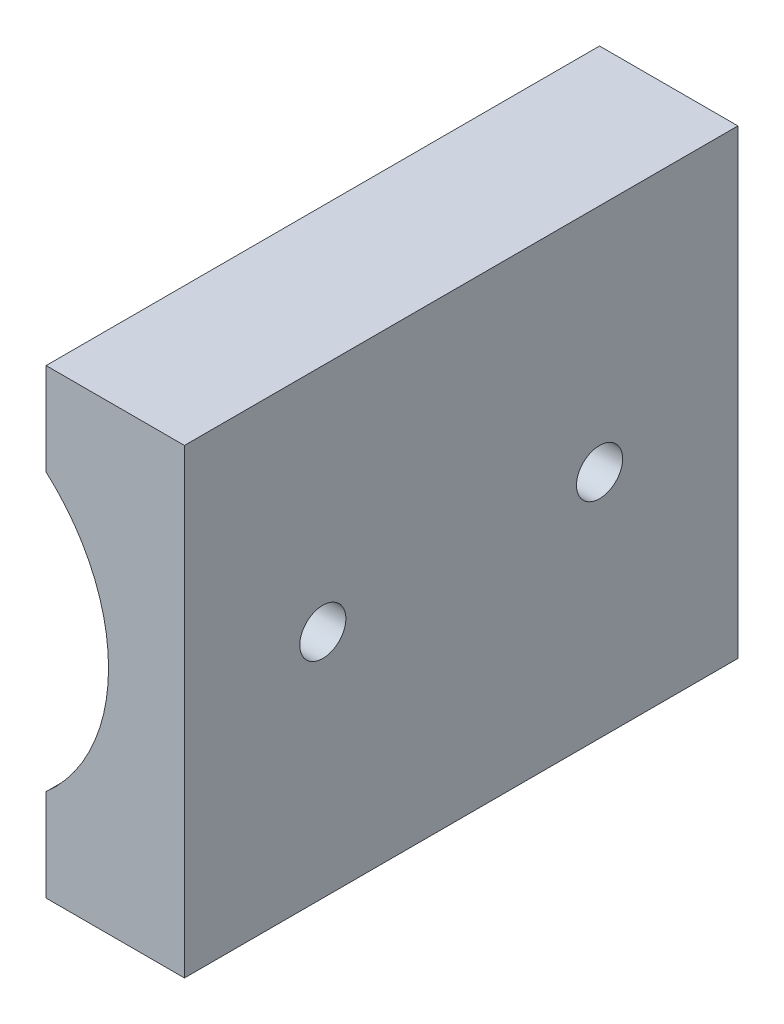
ISO-10303-21;
HEADER;
FILE_DESCRIPTION(('STEP AP214'),'2;1');
FILE_NAME('part.step','',(''),(''),'','','');
FILE_SCHEMA(('AUTOMOTIVE_DESIGN { 1 0 10303 214 1 1 1 1 }'));
ENDSEC;
DATA;
#1=APPLICATION_CONTEXT('core data for automotive mechanical design processes');
#2=APPLICATION_PROTOCOL_DEFINITION('international standard','automotive_design',2000,#1);
#3=PRODUCT_CONTEXT('',#1,'mechanical');
#4=PRODUCT('Part','Part','',(#3));
#5=PRODUCT_RELATED_PRODUCT_CATEGORY('part','',(#4));
#6=PRODUCT_DEFINITION_FORMATION('','',#4);
#7=PRODUCT_DEFINITION_CONTEXT('part definition',#1,'design');
#8=PRODUCT_DEFINITION('design','',#6,#7);
#9=PRODUCT_DEFINITION_SHAPE('','',#8);
#10=(LENGTH_UNIT() NAMED_UNIT(*) SI_UNIT(.MILLI.,.METRE.));
#11=(NAMED_UNIT(*) PLANE_ANGLE_UNIT() SI_UNIT($,.RADIAN.));
#12=(NAMED_UNIT(*) SI_UNIT($,.STERADIAN.) SOLID_ANGLE_UNIT());
#13=UNCERTAINTY_MEASURE_WITH_UNIT(LENGTH_MEASURE(1.E-05),#10,'distance_accuracy_value','');
#14=(GEOMETRIC_REPRESENTATION_CONTEXT(3) GLOBAL_UNCERTAINTY_ASSIGNED_CONTEXT((#13)) GLOBAL_UNIT_ASSIGNED_CONTEXT((#10,
#11,#12)) REPRESENTATION_CONTEXT('',''));
#15=CARTESIAN_POINT('',(0.,0.,0.));
#16=DIRECTION('',(0.,0.,1.));
#17=DIRECTION('',(1.,0.,0.));
#18=AXIS2_PLACEMENT_3D('',#15,#16,#17);
#19=CARTESIAN_POINT('',(-28.2287565553229,-2.54777070063695,60.));
#20=DIRECTION('',(0.,0.,-1.));
#21=DIRECTION('',(-1.,0.,0.));
#22=AXIS2_PLACEMENT_3D('',#19,#20,#21);
#23=CYLINDRICAL_SURFACE('',#22,20.);
#24=CARTESIAN_POINT('',(-28.2287565553229,-2.54777070063695,0.));
#25=DIRECTION('',(0.,0.,-1.));
#26=DIRECTION('',(-1.,0.,0.));
#27=AXIS2_PLACEMENT_3D('',#24,#25,#26);
#28=CIRCLE('',#27,20.);
#29=CARTESIAN_POINT('',(-15.,12.4522292993631,0.));
#30=VERTEX_POINT('',#29);
#31=CARTESIAN_POINT('',(-15.,-17.5477707006369,0.));
#32=VERTEX_POINT('',#31);
#33=EDGE_CURVE('E126',#30,#32,#28,.T.);
#34=ORIENTED_EDGE('',*,*,#33,.T.);
#35=DIRECTION('',(0.,0.,-1.));
#36=VECTOR('',#35,1.);
#37=CARTESIAN_POINT('',(-15.,-17.5477707006369,60.));
#38=LINE('',#37,#36);
#39=CARTESIAN_POINT('',(-15.,-17.5477707006369,60.));
#40=VERTEX_POINT('',#39);
#41=EDGE_CURVE('E111',#40,#32,#38,.T.);
#42=ORIENTED_EDGE('',*,*,#41,.F.);
#43=CARTESIAN_POINT('',(-28.2287565553229,-2.54777070063695,60.));
#44=DIRECTION('',(0.,0.,-1.));
#45=DIRECTION('',(-1.,0.,0.));
#46=AXIS2_PLACEMENT_3D('',#43,#44,#45);
#47=CIRCLE('',#46,20.);
#48=CARTESIAN_POINT('',(-15.,12.4522292993631,60.));
#49=VERTEX_POINT('',#48);
#50=EDGE_CURVE('E102',#49,#40,#47,.T.);
#51=ORIENTED_EDGE('',*,*,#50,.F.);
#52=DIRECTION('',(0.,0.,-1.));
#53=VECTOR('',#52,1.);
#54=CARTESIAN_POINT('',(-15.,12.4522292993631,60.));
#55=LINE('',#54,#53);
#56=EDGE_CURVE('E43',#49,#30,#55,.T.);
#57=ORIENTED_EDGE('',*,*,#56,.T.);
#58=EDGE_LOOP('',(#34,#42,#51,#57));
#59=FACE_BOUND('',#58,.T.);
#60=CARTESIAN_POINT('',(-8.22875655532294,-2.54777070063694,12.5));
#61=CARTESIAN_POINT('',(-8.22875850635866,-2.6876117961927,12.5000059409357));
#62=CARTESIAN_POINT('',(-8.23023870977393,-2.82754027493969,12.5117728791693));
#63=CARTESIAN_POINT('',(-8.23600115420934,-3.10350350272669,12.5585277545708));
#64=CARTESIAN_POINT('',(-8.24028632090865,-3.23953403126069,12.5935399379234));
#65=CARTESIAN_POINT('',(-8.25117594487888,-3.50366627545,12.6857376439141));
#66=CARTESIAN_POINT('',(-8.25777884076752,-3.63177326078308,12.7429082418099));
#67=CARTESIAN_POINT('',(-8.27256954654197,-3.87655017552998,12.8777672839698));
#68=CARTESIAN_POINT('',(-8.28075708448179,-3.99322206219331,12.9554522085307));
#69=CARTESIAN_POINT('',(-8.29785334225969,-4.21248351756826,13.1295919498396));
#70=CARTESIAN_POINT('',(-8.30676540839877,-4.31500106557407,13.2261371293462));
#71=CARTESIAN_POINT('',(-8.32427929522544,-4.50242349419443,13.4350628235366));
#72=CARTESIAN_POINT('',(-8.33288110008026,-4.58732747702919,13.5474441449132));
#73=CARTESIAN_POINT('',(-8.34883349912709,-4.73738086192088,13.7853199775657));
#74=CARTESIAN_POINT('',(-8.35617978354383,-4.80246279657801,13.9108573615679));
#75=CARTESIAN_POINT('',(-8.36874527074612,-4.91059377721206,14.1711870519474));
#76=CARTESIAN_POINT('',(-8.37396455419159,-4.95364365870216,14.305979007147));
#77=CARTESIAN_POINT('',(-8.38165315928681,-5.0162696806617,14.5802441955868));
#78=CARTESIAN_POINT('',(-8.38413672095549,-5.03596741536864,14.7196892577042));
#79=CARTESIAN_POINT('',(-8.38611627389503,-5.05170625019417,14.9999262634718));
#80=CARTESIAN_POINT('',(-8.38561238530787,-5.04774830163936,15.1407181527313));
#81=CARTESIAN_POINT('',(-8.38168700162542,-5.01638793708484,15.4188048272488));
#82=CARTESIAN_POINT('',(-8.37828217571965,-4.98911946362164,15.5561149862003));
#83=CARTESIAN_POINT('',(-8.36896455774665,-4.91212108381899,15.824195021219));
#84=CARTESIAN_POINT('',(-8.36305171486571,-4.86239072238885,15.954964764714));
#85=CARTESIAN_POINT('',(-8.34936539667643,-4.74173626054859,16.2066679990217));
#86=CARTESIAN_POINT('',(-8.34158682320851,-4.67075395434458,16.327573300249));
#87=CARTESIAN_POINT('',(-8.32504944101697,-4.50965217009386,16.5558066944132));
#88=CARTESIAN_POINT('',(-8.31629058746632,-4.41953181671772,16.6631341659737));
#89=CARTESIAN_POINT('',(-8.2987054564187,-4.22196981139072,16.8619427107227));
#90=CARTESIAN_POINT('',(-8.28987913145404,-4.11441270847695,16.953309091766));
#91=CARTESIAN_POINT('',(-8.27321022976442,-3.88542786975086,17.1167088800305));
#92=CARTESIAN_POINT('',(-8.26536765530789,-3.76400010195519,17.188742242672));
#93=CARTESIAN_POINT('',(-8.25154503313715,-3.51063237200042,17.3114313204639));
#94=CARTESIAN_POINT('',(-8.24556561130758,-3.37868889597466,17.3620798538812));
#95=CARTESIAN_POINT('',(-8.23614869752233,-3.108078641068,17.4404704935233));
#96=CARTESIAN_POINT('',(-8.23271108656425,-2.96941217726761,17.468213672137));
#97=CARTESIAN_POINT('',(-8.22878059121535,-2.69028386455044,17.4998574242606));
#98=CARTESIAN_POINT('',(-8.22826819389659,-2.54984019083555,17.5039159923641));
#99=CARTESIAN_POINT('',(-8.23019317526865,-2.27027466413945,17.488492265944));
#100=CARTESIAN_POINT('',(-8.23263049114082,-2.13115278307224,17.4690104727484));
#101=CARTESIAN_POINT('',(-8.24016886775603,-1.85864619291542,17.4071902912256));
#102=CARTESIAN_POINT('',(-8.24526114718426,-1.72524413021224,17.3649272365974));
#103=CARTESIAN_POINT('',(-8.25753932432098,-1.46742104577854,17.2588225480871));
#104=CARTESIAN_POINT('',(-8.26472529311671,-1.34300032917163,17.1949801815086));
#105=CARTESIAN_POINT('',(-8.28043832622182,-1.10596617994952,17.0471468624925));
#106=CARTESIAN_POINT('',(-8.28897211489786,-0.993416940693123,16.9630537101944));
#107=CARTESIAN_POINT('',(-8.30640513206639,-0.783973711010624,16.7772505024658));
#108=CARTESIAN_POINT('',(-8.31530437505397,-0.687080342300085,16.675539747749));
#109=CARTESIAN_POINT('',(-8.3325255006971,-0.511138741818927,16.4566925832429));
#110=CARTESIAN_POINT('',(-8.34084380810968,-0.432195240069011,16.3394716536896));
#111=CARTESIAN_POINT('',(-8.35590244495146,-0.295117811193438,16.0933417551453));
#112=CARTESIAN_POINT('',(-8.36264280601267,-0.236983466908575,15.9644330205235));
#113=CARTESIAN_POINT('',(-8.37375805139299,-0.143344121770403,15.6989246808524));
#114=CARTESIAN_POINT('',(-8.37813910347506,-0.107780073179836,15.562346169952));
#115=CARTESIAN_POINT('',(-8.3840573962484,-0.0601007067690974,15.2850975162193));
#116=CARTESIAN_POINT('',(-8.38559476923518,-0.0479842981011809,15.144427564041));
#117=CARTESIAN_POINT('',(-8.3856477854984,-0.0475641645521071,14.8640310707953));
#118=CARTESIAN_POINT('',(-8.38418430780341,-0.0590959029376697,14.7243047516681));
#119=CARTESIAN_POINT('',(-8.37844540995093,-0.105296295787617,14.4487928706549));
#120=CARTESIAN_POINT('',(-8.37416998949214,-0.139964952731174,14.3130073091912));
#121=CARTESIAN_POINT('',(-8.36329539757745,-0.231403626947287,14.0492530432336));
#122=CARTESIAN_POINT('',(-8.35669705939511,-0.288165719666009,13.9212815549782));
#123=CARTESIAN_POINT('',(-8.34191872287475,-0.422163798486632,13.6766533459517));
#124=CARTESIAN_POINT('',(-8.33373870471882,-0.499400041127352,13.5599967669802));
#125=CARTESIAN_POINT('',(-8.31665050780061,-0.672764369371103,13.3404687746595));
#126=CARTESIAN_POINT('',(-8.30773783448261,-0.769015074861984,13.237694539045));
#127=CARTESIAN_POINT('',(-8.29022823939394,-0.977420473668559,13.049693174832));
#128=CARTESIAN_POINT('',(-8.28163139256704,-1.08957891149537,12.9644701892257));
#129=CARTESIAN_POINT('',(-8.26568598945548,-1.32710507978273,12.8137146428947));
#130=CARTESIAN_POINT('',(-8.25834230453994,-1.45252142104077,12.7482581941007));
#131=CARTESIAN_POINT('',(-8.2457800645557,-1.71258779833566,12.6394287570837));
#132=CARTESIAN_POINT('',(-8.2405592016272,-1.84722761976671,12.5960317736465));
#133=CARTESIAN_POINT('',(-8.23408935204549,-2.07676492866902,12.5429406618287));
#134=CARTESIAN_POINT('',(-8.23209929636841,-2.17021503712002,12.5268610580179));
#135=CARTESIAN_POINT('',(-8.22943224203106,-2.35835363742451,12.5053887543068));
#136=CARTESIAN_POINT('',(-8.22875523368825,-2.45304212014091,12.4999959756007));
#137=CARTESIAN_POINT('',(-8.22875655532294,-2.54777070063694,12.5));
#138=B_SPLINE_CURVE_WITH_KNOTS('',3,(#60,#61,#62,#63,#64,#65,#66,#67,#68,#69,#70,#71,#72,#73,
#74,#75,#76,#77,#78,#79,#80,#81,#82,#83,#84,#85,#86,#87,#88,#89,#90,#91,#92,#93,#94,#95,#96,#97,
#98,#99,#100,#101,#102,#103,#104,#105,#106,#107,#108,#109,#110,#111,#112,#113,#114,#115,#116,
#117,#118,#119,#120,#121,#122,#123,#124,#125,#126,#127,#128,#129,#130,#131,#132,#133,#134,#135,
#136,#137),.UNSPECIFIED.,.T.,.F.,(4,2,2,2,2,2,2,2,2,2,2,2,2,2,2,2,2,2,2,2,2,2,2,2,2,2,2,2,2,2,2,
2,2,2,2,2,2,2,4),(0.,0.419177272776246,0.838792460943426,1.25812550818177,1.67738665591073,
2.09870813201843,2.5200510780001,2.94281250318869,3.36555789496807,3.78609225286321,
4.20660969884664,4.62472696441691,5.04285270166241,5.46213426285532,5.88143500513638,
6.30363478136416,6.72583553113113,7.14817795731605,7.5705006090378,7.99000279391921,
8.40949604501928,8.82761053893395,9.24573923078947,9.66602402928422,10.0863255137509,
10.5090197150757,10.9317054422154,11.3532807428092,11.7748364301062,12.1934690120221,
12.6121016387955,13.0305842470649,13.4490720991226,13.8703523769183,14.2917319847001,
14.7147140303685,15.1372349868403,15.4211884318763,15.7051397830044),.UNSPECIFIED.);
#139=CARTESIAN_POINT('',(-8.22875655532294,-2.54777070063694,12.5));
#140=VERTEX_POINT('',#139);
#141=EDGE_CURVE('E137',#140,#140,#138,.T.);
#142=ORIENTED_EDGE('',*,*,#141,.F.);
#143=EDGE_LOOP('',(#142));
#144=FACE_BOUND('',#143,.T.);
#145=CARTESIAN_POINT('',(-8.22875655532294,-2.54777070063694,42.5));
#146=CARTESIAN_POINT('',(-8.22875850635866,-2.6876117961927,42.5000059409357));
#147=CARTESIAN_POINT('',(-8.23023870977393,-2.82754027493969,42.5117728791693));
#148=CARTESIAN_POINT('',(-8.23600115420934,-3.10350350272669,42.5585277545708));
#149=CARTESIAN_POINT('',(-8.24028632090865,-3.23953403126069,42.5935399379234));
#150=CARTESIAN_POINT('',(-8.25117594487888,-3.50366627545,42.6857376439141));
#151=CARTESIAN_POINT('',(-8.25777884076753,-3.63177326078308,42.7429082418099));
#152=CARTESIAN_POINT('',(-8.27256954654197,-3.87655017552998,42.8777672839698));
#153=CARTESIAN_POINT('',(-8.28075708448179,-3.99322206219331,42.9554522085307));
#154=CARTESIAN_POINT('',(-8.29785334225969,-4.21248351756826,43.1295919498396));
#155=CARTESIAN_POINT('',(-8.30676540839878,-4.31500106557407,43.2261371293462));
#156=CARTESIAN_POINT('',(-8.32427929522544,-4.50242349419443,43.4350628235366));
#157=CARTESIAN_POINT('',(-8.33288110008026,-4.58732747702919,43.5474441449132));
#158=CARTESIAN_POINT('',(-8.3488334991271,-4.73738086192088,43.7853199775657));
#159=CARTESIAN_POINT('',(-8.35617978354384,-4.80246279657802,43.9108573615679));
#160=CARTESIAN_POINT('',(-8.36874527074612,-4.91059377721206,44.1711870519474));
#161=CARTESIAN_POINT('',(-8.37396455419159,-4.95364365870216,44.305979007147));
#162=CARTESIAN_POINT('',(-8.38165315928681,-5.01626968066171,44.5802441955868));
#163=CARTESIAN_POINT('',(-8.3841367209555,-5.03596741536865,44.7196892577042));
#164=CARTESIAN_POINT('',(-8.38611627389503,-5.05170625019417,44.9999262634718));
#165=CARTESIAN_POINT('',(-8.38561238530787,-5.04774830163936,45.1407181527313));
#166=CARTESIAN_POINT('',(-8.38168700162543,-5.01638793708485,45.4188048272488));
#167=CARTESIAN_POINT('',(-8.37828217571966,-4.98911946362164,45.5561149862003));
#168=CARTESIAN_POINT('',(-8.36896455774666,-4.91212108381899,45.824195021219));
#169=CARTESIAN_POINT('',(-8.36305171486571,-4.86239072238885,45.954964764714));
#170=CARTESIAN_POINT('',(-8.34936539667643,-4.74173626054859,46.2066679990217));
#171=CARTESIAN_POINT('',(-8.34158682320851,-4.67075395434458,46.327573300249));
#172=CARTESIAN_POINT('',(-8.32504944101697,-4.50965217009386,46.5558066944132));
#173=CARTESIAN_POINT('',(-8.31629058746632,-4.41953181671772,46.6631341659737));
#174=CARTESIAN_POINT('',(-8.2987054564187,-4.22196981139072,46.8619427107227));
#175=CARTESIAN_POINT('',(-8.28987913145404,-4.11441270847696,46.953309091766));
#176=CARTESIAN_POINT('',(-8.27321022976442,-3.88542786975087,47.1167088800306));
#177=CARTESIAN_POINT('',(-8.26536765530789,-3.7640001019552,47.188742242672));
#178=CARTESIAN_POINT('',(-8.25154503313715,-3.51063237200043,47.3114313204639));
#179=CARTESIAN_POINT('',(-8.24556561130758,-3.37868889597466,47.3620798538812));
#180=CARTESIAN_POINT('',(-8.23614869752233,-3.108078641068,47.4404704935233));
#181=CARTESIAN_POINT('',(-8.23271108656425,-2.96941217726761,47.468213672137));
#182=CARTESIAN_POINT('',(-8.22878059121534,-2.69028386455044,47.4998574242605));
#183=CARTESIAN_POINT('',(-8.22826819389659,-2.54984019083555,47.5039159923641));
#184=CARTESIAN_POINT('',(-8.23019317526865,-2.27027466413944,47.4884922659441));
#185=CARTESIAN_POINT('',(-8.23263049114082,-2.13115278307223,47.4690104727484));
#186=CARTESIAN_POINT('',(-8.24016886775602,-1.85864619291542,47.4071902912256));
#187=CARTESIAN_POINT('',(-8.24526114718426,-1.72524413021223,47.3649272365974));
#188=CARTESIAN_POINT('',(-8.25753932432098,-1.46742104577853,47.2588225480871));
#189=CARTESIAN_POINT('',(-8.26472529311671,-1.34300032917163,47.1949801815086));
#190=CARTESIAN_POINT('',(-8.28043832622183,-1.10596617994951,47.0471468624925));
#191=CARTESIAN_POINT('',(-8.28897211489786,-0.99341694069312,46.9630537101944));
#192=CARTESIAN_POINT('',(-8.30640513206638,-0.783973711010621,46.7772505024658));
#193=CARTESIAN_POINT('',(-8.31530437505396,-0.687080342300082,46.675539747749));
#194=CARTESIAN_POINT('',(-8.3325255006971,-0.511138741818924,46.4566925832429));
#195=CARTESIAN_POINT('',(-8.34084380810968,-0.432195240069007,46.3394716536896));
#196=CARTESIAN_POINT('',(-8.35590244495146,-0.295117811193434,46.0933417551453));
#197=CARTESIAN_POINT('',(-8.36264280601268,-0.236983466908572,45.9644330205235));
#198=CARTESIAN_POINT('',(-8.373758051393,-0.1433441217704,45.6989246808524));
#199=CARTESIAN_POINT('',(-8.37813910347506,-0.107780073179832,45.562346169952));
#200=CARTESIAN_POINT('',(-8.3840573962484,-0.060100706769094,45.2850975162193));
#201=CARTESIAN_POINT('',(-8.38559476923518,-0.0479842981011774,45.144427564041));
#202=CARTESIAN_POINT('',(-8.3856477854984,-0.0475641645521031,44.8640310707953));
#203=CARTESIAN_POINT('',(-8.38418430780341,-0.0590959029376659,44.7243047516681));
#204=CARTESIAN_POINT('',(-8.37844540995094,-0.105296295787613,44.4487928706549));
#205=CARTESIAN_POINT('',(-8.37416998949213,-0.13996495273117,44.3130073091912));
#206=CARTESIAN_POINT('',(-8.36329539757745,-0.231403626947284,44.0492530432336));
#207=CARTESIAN_POINT('',(-8.35669705939511,-0.288165719666008,43.9212815549782));
#208=CARTESIAN_POINT('',(-8.34191872287476,-0.422163798486632,43.6766533459517));
#209=CARTESIAN_POINT('',(-8.33373870471882,-0.499400041127351,43.5599967669802));
#210=CARTESIAN_POINT('',(-8.31665050780061,-0.6727643693711,43.3404687746595));
#211=CARTESIAN_POINT('',(-8.30773783448262,-0.769015074861981,43.237694539045));
#212=CARTESIAN_POINT('',(-8.29022823939395,-0.977420473668557,43.049693174832));
#213=CARTESIAN_POINT('',(-8.28163139256705,-1.08957891149537,42.9644701892257));
#214=CARTESIAN_POINT('',(-8.26568598945548,-1.32710507978273,42.8137146428947));
#215=CARTESIAN_POINT('',(-8.25834230453994,-1.45252142104077,42.7482581941007));
#216=CARTESIAN_POINT('',(-8.2457800645557,-1.71258779833566,42.6394287570837));
#217=CARTESIAN_POINT('',(-8.2405592016272,-1.8472276197667,42.5960317736465));
#218=CARTESIAN_POINT('',(-8.23408935204549,-2.07676492866901,42.5429406618287));
#219=CARTESIAN_POINT('',(-8.23209929636841,-2.17021503712002,42.5268610580179));
#220=CARTESIAN_POINT('',(-8.22943224203106,-2.35835363742451,42.5053887543068));
#221=CARTESIAN_POINT('',(-8.22875523368825,-2.45304212014091,42.4999959756007));
#222=CARTESIAN_POINT('',(-8.22875655532294,-2.54777070063694,42.5));
#223=B_SPLINE_CURVE_WITH_KNOTS('',3,(#145,#146,#147,#148,#149,#150,#151,#152,#153,#154,#155,
#156,#157,#158,#159,#160,#161,#162,#163,#164,#165,#166,#167,#168,#169,#170,#171,#172,#173,#174,
#175,#176,#177,#178,#179,#180,#181,#182,#183,#184,#185,#186,#187,#188,#189,#190,#191,#192,#193,
#194,#195,#196,#197,#198,#199,#200,#201,#202,#203,#204,#205,#206,#207,#208,#209,#210,#211,#212,
#213,#214,#215,#216,#217,#218,#219,#220,#221,#222),.UNSPECIFIED.,.T.,.F.,(4,2,2,2,2,2,2,2,2,2,2,
2,2,2,2,2,2,2,2,2,2,2,2,2,2,2,2,2,2,2,2,2,2,2,2,2,2,2,4),(0.,0.419177272776248,
0.838792460943427,1.25812550818177,1.67738665591073,2.09870813201843,2.52005107800011,
2.9428125031887,3.36555789496807,3.78609225286321,4.20660969884664,4.62472696441693,
5.04285270166242,5.46213426285534,5.88143500513638,6.30363478136417,6.72583553113114,
7.14817795731605,7.57050060903781,7.99000279391922,8.40949604501929,8.82761053893396,
9.24573923078948,9.66602402928423,10.0863255137509,10.5090197150757,10.9317054422154,
11.3532807428093,11.7748364301062,12.1934690120222,12.6121016387955,13.0305842470649,
13.4490720991226,13.8703523769183,14.2917319847001,14.7147140303685,15.1372349868403,
15.4211884318763,15.7051397830044),.UNSPECIFIED.);
#224=CARTESIAN_POINT('',(-8.22875655532294,-2.54777070063694,42.5));
#225=VERTEX_POINT('',#224);
#226=EDGE_CURVE('E145',#225,#225,#223,.T.);
#227=ORIENTED_EDGE('',*,*,#226,.F.);
#228=EDGE_LOOP('',(#227));
#229=FACE_BOUND('',#228,.T.);
#230=ADVANCED_FACE('F33',(#59,#144,#229),#23,.F.);
#231=CARTESIAN_POINT('',(0.,22.4522292993631,60.));
#232=DIRECTION('',(0.,-1.,0.));
#233=DIRECTION('',(1.,0.,0.));
#234=AXIS2_PLACEMENT_3D('',#231,#232,#233);
#235=PLANE('',#234);
#236=DIRECTION('',(-1.,0.,0.));
#237=VECTOR('',#236,1.);
#238=CARTESIAN_POINT('',(0.,22.4522292993631,0.));
#239=LINE('',#238,#237);
#240=CARTESIAN_POINT('',(0.,22.4522292993631,0.));
#241=VERTEX_POINT('',#240);
#242=CARTESIAN_POINT('',(-15.,22.4522292993631,0.));
#243=VERTEX_POINT('',#242);
#244=EDGE_CURVE('E120',#241,#243,#239,.T.);
#245=ORIENTED_EDGE('',*,*,#244,.T.);
#246=DIRECTION('',(0.,0.,-1.));
#247=VECTOR('',#246,1.);
#248=CARTESIAN_POINT('',(-15.,22.4522292993631,60.));
#249=LINE('',#248,#247);
#250=CARTESIAN_POINT('',(-15.,22.4522292993631,60.));
#251=VERTEX_POINT('',#250);
#252=EDGE_CURVE('E11',#251,#243,#249,.T.);
#253=ORIENTED_EDGE('',*,*,#252,.F.);
#254=DIRECTION('',(-1.,0.,0.));
#255=VECTOR('',#254,1.);
#256=CARTESIAN_POINT('',(0.,22.4522292993631,60.));
#257=LINE('',#256,#255);
#258=CARTESIAN_POINT('',(0.,22.4522292993631,60.));
#259=VERTEX_POINT('',#258);
#260=EDGE_CURVE('E131',#259,#251,#257,.T.);
#261=ORIENTED_EDGE('',*,*,#260,.F.);
#262=DIRECTION('',(0.,0.,-1.));
#263=VECTOR('',#262,1.);
#264=CARTESIAN_POINT('',(0.,22.4522292993631,60.));
#265=LINE('',#264,#263);
#266=EDGE_CURVE('E116',#259,#241,#265,.T.);
#267=ORIENTED_EDGE('',*,*,#266,.T.);
#268=EDGE_LOOP('',(#245,#253,#261,#267));
#269=FACE_BOUND('',#268,.T.);
#270=ADVANCED_FACE('F35',(#269),#235,.F.);
#271=CARTESIAN_POINT('',(-15.,22.4522292993631,60.));
#272=DIRECTION('',(1.,0.,0.));
#273=DIRECTION('',(0.,1.,0.));
#274=AXIS2_PLACEMENT_3D('',#271,#272,#273);
#275=PLANE('',#274);
#276=DIRECTION('',(0.,-1.,0.));
#277=VECTOR('',#276,1.);
#278=CARTESIAN_POINT('',(-15.,22.4522292993631,0.));
#279=LINE('',#278,#277);
#280=EDGE_CURVE('E123',#243,#30,#279,.T.);
#281=ORIENTED_EDGE('',*,*,#280,.T.);
#282=ORIENTED_EDGE('',*,*,#56,.F.);
#283=DIRECTION('',(0.,-1.,0.));
#284=VECTOR('',#283,1.);
#285=CARTESIAN_POINT('',(-15.,22.4522292993631,60.));
#286=LINE('',#285,#284);
#287=EDGE_CURVE('E89',#251,#49,#286,.T.);
#288=ORIENTED_EDGE('',*,*,#287,.F.);
#289=ORIENTED_EDGE('',*,*,#252,.T.);
#290=EDGE_LOOP('',(#281,#282,#288,#289));
#291=FACE_BOUND('',#290,.T.);
#292=ADVANCED_FACE('F179',(#291),#275,.F.);
#293=CARTESIAN_POINT('',(-15.,-27.5477707006369,60.));
#294=DIRECTION('',(1.,0.,0.));
#295=DIRECTION('',(0.,0.,-1.));
#296=AXIS2_PLACEMENT_3D('',#293,#294,#295);
#297=PLANE('',#296);
#298=DIRECTION('',(0.,-1.,0.));
#299=VECTOR('',#298,1.);
#300=CARTESIAN_POINT('',(-15.,-27.5477707006369,0.));
#301=LINE('',#300,#299);
#302=CARTESIAN_POINT('',(-15.,-27.5477707006369,0.));
#303=VERTEX_POINT('',#302);
#304=EDGE_CURVE('E110',#32,#303,#301,.T.);
#305=ORIENTED_EDGE('',*,*,#304,.T.);
#306=DIRECTION('',(0.,0.,-1.));
#307=VECTOR('',#306,1.);
#308=CARTESIAN_POINT('',(-15.,-27.5477707006369,60.));
#309=LINE('',#308,#307);
#310=CARTESIAN_POINT('',(-15.,-27.5477707006369,60.));
#311=VERTEX_POINT('',#310);
#312=EDGE_CURVE('E107',#311,#303,#309,.T.);
#313=ORIENTED_EDGE('',*,*,#312,.F.);
#314=DIRECTION('',(0.,-1.,0.));
#315=VECTOR('',#314,1.);
#316=CARTESIAN_POINT('',(-15.,-27.5477707006369,60.));
#317=LINE('',#316,#315);
#318=EDGE_CURVE('E96',#40,#311,#317,.T.);
#319=ORIENTED_EDGE('',*,*,#318,.F.);
#320=ORIENTED_EDGE('',*,*,#41,.T.);
#321=EDGE_LOOP('',(#305,#313,#319,#320));
#322=FACE_BOUND('',#321,.T.);
#323=ADVANCED_FACE('F108',(#322),#297,.F.);
#324=CARTESIAN_POINT('',(0.,-27.5477707006369,60.));
#325=DIRECTION('',(0.,1.,0.));
#326=DIRECTION('',(-1.,0.,0.));
#327=AXIS2_PLACEMENT_3D('',#324,#325,#326);
#328=PLANE('',#327);
#329=DIRECTION('',(1.,0.,0.));
#330=VECTOR('',#329,1.);
#331=CARTESIAN_POINT('',(0.,-27.5477707006369,0.));
#332=LINE('',#331,#330);
#333=CARTESIAN_POINT('',(0.,-27.5477707006369,0.));
#334=VERTEX_POINT('',#333);
#335=EDGE_CURVE('E75',#303,#334,#332,.T.);
#336=ORIENTED_EDGE('',*,*,#335,.T.);
#337=DIRECTION('',(0.,0.,-1.));
#338=VECTOR('',#337,1.);
#339=CARTESIAN_POINT('',(0.,-27.5477707006369,60.));
#340=LINE('',#339,#338);
#341=CARTESIAN_POINT('',(0.,-27.5477707006369,60.));
#342=VERTEX_POINT('',#341);
#343=EDGE_CURVE('E112',#342,#334,#340,.T.);
#344=ORIENTED_EDGE('',*,*,#343,.F.);
#345=DIRECTION('',(1.,0.,0.));
#346=VECTOR('',#345,1.);
#347=CARTESIAN_POINT('',(0.,-27.5477707006369,60.));
#348=LINE('',#347,#346);
#349=EDGE_CURVE('E100',#311,#342,#348,.T.);
#350=ORIENTED_EDGE('',*,*,#349,.F.);
#351=ORIENTED_EDGE('',*,*,#312,.T.);
#352=EDGE_LOOP('',(#336,#344,#350,#351));
#353=FACE_BOUND('',#352,.T.);
#354=ADVANCED_FACE('F114',(#353),#328,.F.);
#355=CARTESIAN_POINT('',(0.,22.4522292993631,60.));
#356=DIRECTION('',(-1.,0.,0.));
#357=DIRECTION('',(0.,0.,1.));
#358=AXIS2_PLACEMENT_3D('',#355,#356,#357);
#359=PLANE('',#358);
#360=CARTESIAN_POINT('',(0.,-2.54777070063694,45.));
#361=DIRECTION('',(-1.,0.,0.));
#362=DIRECTION('',(0.,0.,1.));
#363=AXIS2_PLACEMENT_3D('',#360,#361,#362);
#364=CIRCLE('',#363,2.5);
#365=CARTESIAN_POINT('',(0.,-2.54777070063694,47.5));
#366=VERTEX_POINT('',#365);
#367=EDGE_CURVE('E37',#366,#366,#364,.F.);
#368=ORIENTED_EDGE('',*,*,#367,.F.);
#369=EDGE_LOOP('',(#368));
#370=FACE_BOUND('',#369,.T.);
#371=CARTESIAN_POINT('',(0.,-2.54777070063694,15.));
#372=DIRECTION('',(-1.,0.,0.));
#373=DIRECTION('',(0.,0.,1.));
#374=AXIS2_PLACEMENT_3D('',#371,#372,#373);
#375=CIRCLE('',#374,2.5);
#376=CARTESIAN_POINT('',(0.,-2.54777070063694,17.5));
#377=VERTEX_POINT('',#376);
#378=EDGE_CURVE('E124',#377,#377,#375,.F.);
#379=ORIENTED_EDGE('',*,*,#378,.F.);
#380=EDGE_LOOP('',(#379));
#381=FACE_BOUND('',#380,.T.);
#382=DIRECTION('',(0.,1.,0.));
#383=VECTOR('',#382,1.);
#384=CARTESIAN_POINT('',(0.,22.4522292993631,0.));
#385=LINE('',#384,#383);
#386=EDGE_CURVE('E81',#334,#241,#385,.T.);
#387=ORIENTED_EDGE('',*,*,#386,.T.);
#388=ORIENTED_EDGE('',*,*,#266,.F.);
#389=DIRECTION('',(0.,1.,0.));
#390=VECTOR('',#389,1.);
#391=CARTESIAN_POINT('',(0.,22.4522292993631,60.));
#392=LINE('',#391,#390);
#393=EDGE_CURVE('E52',#342,#259,#392,.T.);
#394=ORIENTED_EDGE('',*,*,#393,.F.);
#395=ORIENTED_EDGE('',*,*,#343,.T.);
#396=EDGE_LOOP('',(#387,#388,#394,#395));
#397=FACE_BOUND('',#396,.T.);
#398=ADVANCED_FACE('F193',(#370,#381,#397),#359,.F.);
#399=CARTESIAN_POINT('',(-28.2287565553229,-2.54777070063695,60.));
#400=DIRECTION('',(0.,0.,-1.));
#401=DIRECTION('',(-1.,0.,0.));
#402=AXIS2_PLACEMENT_3D('',#399,#400,#401);
#403=PLANE('',#402);
#404=ORIENTED_EDGE('',*,*,#260,.T.);
#405=ORIENTED_EDGE('',*,*,#287,.T.);
#406=ORIENTED_EDGE('',*,*,#50,.T.);
#407=ORIENTED_EDGE('',*,*,#318,.T.);
#408=ORIENTED_EDGE('',*,*,#349,.T.);
#409=ORIENTED_EDGE('',*,*,#393,.T.);
#410=EDGE_LOOP('',(#404,#405,#406,#407,#408,#409));
#411=FACE_BOUND('',#410,.T.);
#412=ADVANCED_FACE('F98',(#411),#403,.F.);
#413=CARTESIAN_POINT('',(-28.2287565553229,-2.54777070063695,0.));
#414=DIRECTION('',(0.,0.,-1.));
#415=DIRECTION('',(-1.,0.,0.));
#416=AXIS2_PLACEMENT_3D('',#413,#414,#415);
#417=PLANE('',#416);
#418=ORIENTED_EDGE('',*,*,#244,.F.);
#419=ORIENTED_EDGE('',*,*,#386,.F.);
#420=ORIENTED_EDGE('',*,*,#335,.F.);
#421=ORIENTED_EDGE('',*,*,#304,.F.);
#422=ORIENTED_EDGE('',*,*,#33,.F.);
#423=ORIENTED_EDGE('',*,*,#280,.F.);
#424=EDGE_LOOP('',(#418,#419,#420,#421,#422,#423));
#425=FACE_BOUND('',#424,.T.);
#426=ADVANCED_FACE('F170',(#425),#417,.T.);
#427=CARTESIAN_POINT('',(1.2E-05,-2.54777070063694,15.));
#428=DIRECTION('',(-1.,0.,0.));
#429=DIRECTION('',(0.,0.,1.));
#430=AXIS2_PLACEMENT_3D('',#427,#428,#429);
#431=CYLINDRICAL_SURFACE('',#430,2.5);
#432=ORIENTED_EDGE('',*,*,#141,.T.);
#433=EDGE_LOOP('',(#432));
#434=FACE_BOUND('',#433,.T.);
#435=ORIENTED_EDGE('',*,*,#378,.T.);
#436=EDGE_LOOP('',(#435));
#437=FACE_BOUND('',#436,.T.);
#438=ADVANCED_FACE('F165',(#434,#437),#431,.F.);
#439=CARTESIAN_POINT('',(1.2E-05,-2.54777070063694,45.));
#440=DIRECTION('',(-1.,0.,0.));
#441=DIRECTION('',(0.,0.,1.));
#442=AXIS2_PLACEMENT_3D('',#439,#440,#441);
#443=CYLINDRICAL_SURFACE('',#442,2.5);
#444=ORIENTED_EDGE('',*,*,#226,.T.);
#445=EDGE_LOOP('',(#444));
#446=FACE_BOUND('',#445,.T.);
#447=ORIENTED_EDGE('',*,*,#367,.T.);
#448=EDGE_LOOP('',(#447));
#449=FACE_BOUND('',#448,.T.);
#450=ADVANCED_FACE('F163',(#446,#449),#443,.F.);
#451=CLOSED_SHELL('',(#230,#270,#292,#323,#354,#398,#412,#426,#438,#450));
#452=MANIFOLD_SOLID_BREP('B2',#451);
#453=ADVANCED_BREP_SHAPE_REPRESENTATION('',(#18,#452),#14);
#454=SHAPE_DEFINITION_REPRESENTATION(#9,#453);
ENDSEC;
END-ISO-10303-21;
